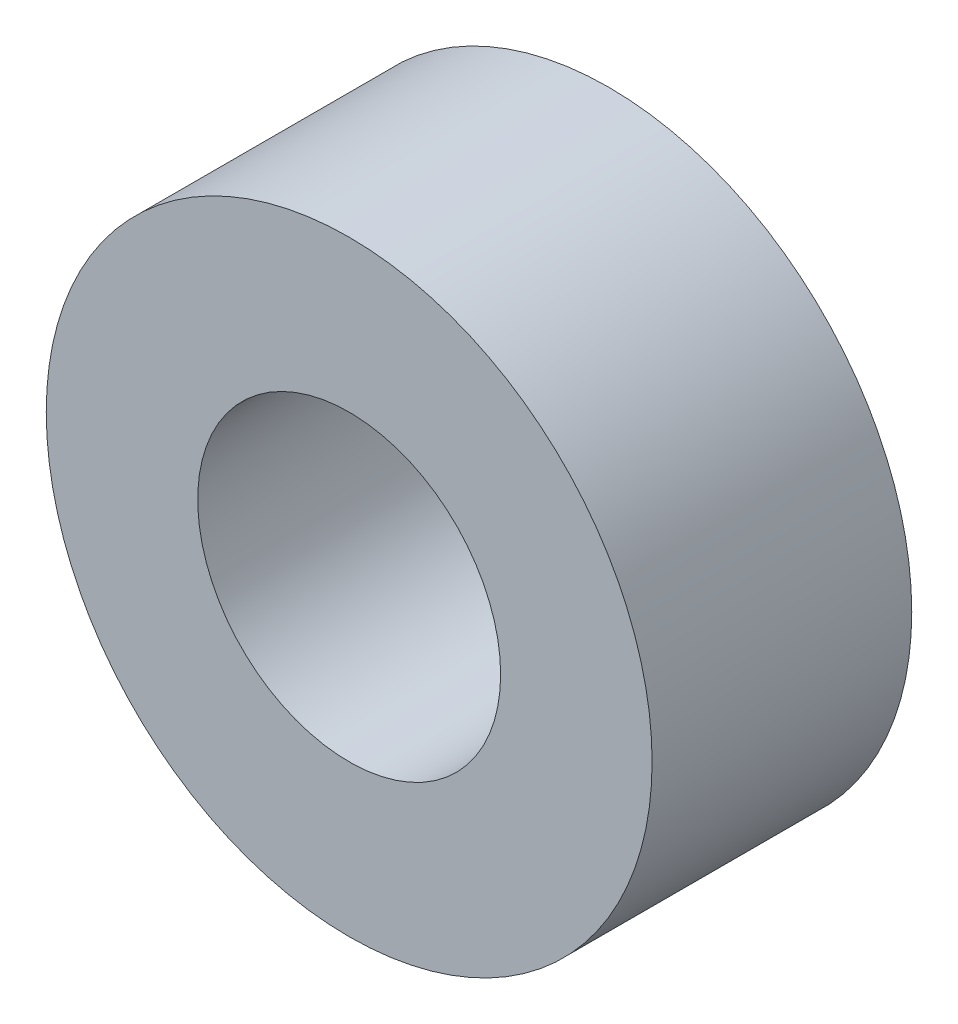
ISO-10303-21;
HEADER;
FILE_DESCRIPTION(('STEP AP214'),'2;1');
FILE_NAME('part.step','',(''),(''),'','','');
FILE_SCHEMA(('AUTOMOTIVE_DESIGN { 1 0 10303 214 1 1 1 1 }'));
ENDSEC;
DATA;
#1=APPLICATION_CONTEXT('core data for automotive mechanical design processes');
#2=APPLICATION_PROTOCOL_DEFINITION('international standard','automotive_design',2000,#1);
#3=PRODUCT_CONTEXT('',#1,'mechanical');
#4=PRODUCT('Part','Part','',(#3));
#5=PRODUCT_RELATED_PRODUCT_CATEGORY('part','',(#4));
#6=PRODUCT_DEFINITION_FORMATION('','',#4);
#7=PRODUCT_DEFINITION_CONTEXT('part definition',#1,'design');
#8=PRODUCT_DEFINITION('design','',#6,#7);
#9=PRODUCT_DEFINITION_SHAPE('','',#8);
#10=(LENGTH_UNIT() NAMED_UNIT(*) SI_UNIT(.MILLI.,.METRE.));
#11=(NAMED_UNIT(*) PLANE_ANGLE_UNIT() SI_UNIT($,.RADIAN.));
#12=(NAMED_UNIT(*) SI_UNIT($,.STERADIAN.) SOLID_ANGLE_UNIT());
#13=UNCERTAINTY_MEASURE_WITH_UNIT(LENGTH_MEASURE(1.E-05),#10,'distance_accuracy_value','');
#14=(GEOMETRIC_REPRESENTATION_CONTEXT(3) GLOBAL_UNCERTAINTY_ASSIGNED_CONTEXT((#13)) GLOBAL_UNIT_ASSIGNED_CONTEXT((#10,
#11,#12)) REPRESENTATION_CONTEXT('',''));
#15=CARTESIAN_POINT('',(0.,0.,0.));
#16=DIRECTION('',(0.,0.,1.));
#17=DIRECTION('',(1.,0.,0.));
#18=AXIS2_PLACEMENT_3D('',#15,#16,#17);
#19=CARTESIAN_POINT('',(0.,0.,3.));
#20=DIRECTION('',(0.,0.,1.));
#21=DIRECTION('',(1.,0.,0.));
#22=AXIS2_PLACEMENT_3D('',#19,#20,#21);
#23=PLANE('',#22);
#24=CARTESIAN_POINT('',(0.,0.,3.));
#25=DIRECTION('',(0.,0.,1.));
#26=DIRECTION('',(1.,0.,0.));
#27=AXIS2_PLACEMENT_3D('',#24,#25,#26);
#28=CIRCLE('',#27,3.5);
#29=CARTESIAN_POINT('',(3.5,0.,3.));
#30=VERTEX_POINT('',#29);
#31=EDGE_CURVE('E10',#30,#30,#28,.T.);
#32=ORIENTED_EDGE('',*,*,#31,.T.);
#33=EDGE_LOOP('',(#32));
#34=FACE_BOUND('',#33,.T.);
#35=CARTESIAN_POINT('',(0.,0.,3.));
#36=DIRECTION('',(0.,0.,1.));
#37=DIRECTION('',(1.,0.,0.));
#38=AXIS2_PLACEMENT_3D('',#35,#36,#37);
#39=CIRCLE('',#38,1.75);
#40=CARTESIAN_POINT('',(1.75,0.,3.));
#41=VERTEX_POINT('',#40);
#42=EDGE_CURVE('E44',#41,#41,#39,.T.);
#43=ORIENTED_EDGE('',*,*,#42,.F.);
#44=EDGE_LOOP('',(#43));
#45=FACE_BOUND('',#44,.T.);
#46=ADVANCED_FACE('F33',(#34,#45),#23,.T.);
#47=CARTESIAN_POINT('',(0.,0.,0.));
#48=DIRECTION('',(0.,0.,1.));
#49=DIRECTION('',(1.,0.,0.));
#50=AXIS2_PLACEMENT_3D('',#47,#48,#49);
#51=PLANE('',#50);
#52=CARTESIAN_POINT('',(0.,0.,0.));
#53=DIRECTION('',(0.,0.,1.));
#54=DIRECTION('',(1.,0.,0.));
#55=AXIS2_PLACEMENT_3D('',#52,#53,#54);
#56=CIRCLE('',#55,3.5);
#57=CARTESIAN_POINT('',(3.5,0.,0.));
#58=VERTEX_POINT('',#57);
#59=EDGE_CURVE('E37',#58,#58,#56,.T.);
#60=ORIENTED_EDGE('',*,*,#59,.F.);
#61=EDGE_LOOP('',(#60));
#62=FACE_BOUND('',#61,.T.);
#63=CARTESIAN_POINT('',(0.,0.,0.));
#64=DIRECTION('',(0.,0.,1.));
#65=DIRECTION('',(1.,0.,0.));
#66=AXIS2_PLACEMENT_3D('',#63,#64,#65);
#67=CIRCLE('',#66,1.75);
#68=CARTESIAN_POINT('',(1.75,0.,0.));
#69=VERTEX_POINT('',#68);
#70=EDGE_CURVE('E46',#69,#69,#67,.T.);
#71=ORIENTED_EDGE('',*,*,#70,.T.);
#72=EDGE_LOOP('',(#71));
#73=FACE_BOUND('',#72,.T.);
#74=ADVANCED_FACE('F56',(#62,#73),#51,.F.);
#75=CARTESIAN_POINT('',(0.,0.,3.));
#76=DIRECTION('',(0.,0.,-1.));
#77=DIRECTION('',(-1.,0.,0.));
#78=AXIS2_PLACEMENT_3D('',#75,#76,#77);
#79=CYLINDRICAL_SURFACE('',#78,3.5);
#80=ORIENTED_EDGE('',*,*,#31,.F.);
#81=EDGE_LOOP('',(#80));
#82=FACE_BOUND('',#81,.T.);
#83=ORIENTED_EDGE('',*,*,#59,.T.);
#84=EDGE_LOOP('',(#83));
#85=FACE_BOUND('',#84,.T.);
#86=ADVANCED_FACE('F35',(#82,#85),#79,.T.);
#87=CARTESIAN_POINT('',(0.,0.,3.));
#88=DIRECTION('',(0.,0.,-1.));
#89=DIRECTION('',(-1.,0.,0.));
#90=AXIS2_PLACEMENT_3D('',#87,#88,#89);
#91=CYLINDRICAL_SURFACE('',#90,1.75);
#92=ORIENTED_EDGE('',*,*,#42,.T.);
#93=EDGE_LOOP('',(#92));
#94=FACE_BOUND('',#93,.T.);
#95=ORIENTED_EDGE('',*,*,#70,.F.);
#96=EDGE_LOOP('',(#95));
#97=FACE_BOUND('',#96,.T.);
#98=ADVANCED_FACE('F52',(#94,#97),#91,.F.);
#99=CLOSED_SHELL('',(#46,#74,#86,#98));
#100=MANIFOLD_SOLID_BREP('B2',#99);
#101=ADVANCED_BREP_SHAPE_REPRESENTATION('',(#18,#100),#14);
#102=SHAPE_DEFINITION_REPRESENTATION(#9,#101);
ENDSEC;
END-ISO-10303-21;
